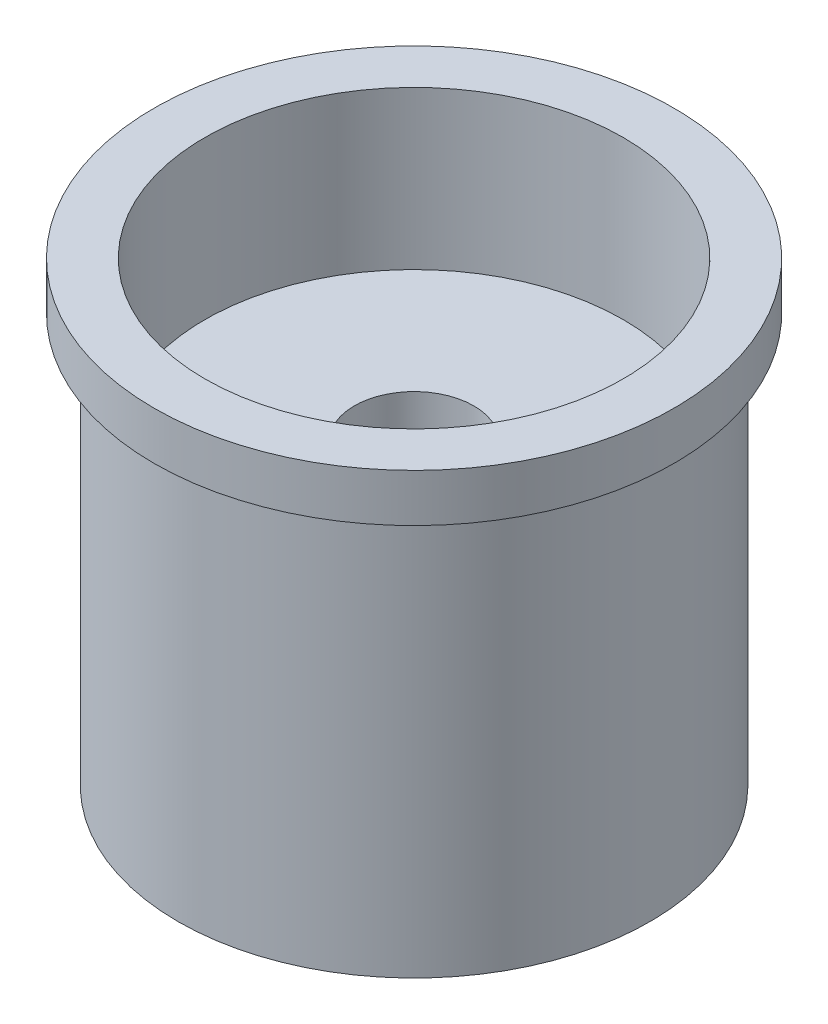
ISO-10303-21;
HEADER;
FILE_DESCRIPTION(('STEP AP214'),'2;1');
FILE_NAME('part.step','',(''),(''),'','','');
FILE_SCHEMA(('AUTOMOTIVE_DESIGN { 1 0 10303 214 1 1 1 1 }'));
ENDSEC;
DATA;
#1=APPLICATION_CONTEXT('core data for automotive mechanical design processes');
#2=APPLICATION_PROTOCOL_DEFINITION('international standard','automotive_design',2000,#1);
#3=PRODUCT_CONTEXT('',#1,'mechanical');
#4=PRODUCT('Part','Part','',(#3));
#5=PRODUCT_RELATED_PRODUCT_CATEGORY('part','',(#4));
#6=PRODUCT_DEFINITION_FORMATION('','',#4);
#7=PRODUCT_DEFINITION_CONTEXT('part definition',#1,'design');
#8=PRODUCT_DEFINITION('design','',#6,#7);
#9=PRODUCT_DEFINITION_SHAPE('','',#8);
#10=(LENGTH_UNIT() NAMED_UNIT(*) SI_UNIT(.MILLI.,.METRE.));
#11=(NAMED_UNIT(*) PLANE_ANGLE_UNIT() SI_UNIT($,.RADIAN.));
#12=(NAMED_UNIT(*) SI_UNIT($,.STERADIAN.) SOLID_ANGLE_UNIT());
#13=UNCERTAINTY_MEASURE_WITH_UNIT(LENGTH_MEASURE(1.E-05),#10,'distance_accuracy_value','');
#14=(GEOMETRIC_REPRESENTATION_CONTEXT(3) GLOBAL_UNCERTAINTY_ASSIGNED_CONTEXT((#13)) GLOBAL_UNIT_ASSIGNED_CONTEXT((#10,
#11,#12)) REPRESENTATION_CONTEXT('',''));
#15=CARTESIAN_POINT('',(0.,0.,0.));
#16=DIRECTION('',(0.,0.,1.));
#17=DIRECTION('',(1.,0.,0.));
#18=AXIS2_PLACEMENT_3D('',#15,#16,#17);
#19=CARTESIAN_POINT('',(0.,34.2,0.));
#20=DIRECTION('',(0.,-1.,0.));
#21=DIRECTION('',(0.,0.,-1.));
#22=AXIS2_PLACEMENT_3D('',#19,#20,#21);
#23=CYLINDRICAL_SURFACE('',#22,19.75);
#24=CARTESIAN_POINT('',(0.,34.2,0.));
#25=DIRECTION('',(0.,1.,0.));
#26=DIRECTION('',(0.,0.,1.));
#27=AXIS2_PLACEMENT_3D('',#24,#25,#26);
#28=CIRCLE('',#27,19.75);
#29=CARTESIAN_POINT('',(0.,34.2,19.75));
#30=VERTEX_POINT('',#29);
#31=EDGE_CURVE('E10',#30,#30,#28,.T.);
#32=ORIENTED_EDGE('',*,*,#31,.F.);
#33=EDGE_LOOP('',(#32));
#34=FACE_BOUND('',#33,.T.);
#35=CARTESIAN_POINT('',(0.,0.,0.));
#36=DIRECTION('',(0.,1.,0.));
#37=DIRECTION('',(0.,0.,1.));
#38=AXIS2_PLACEMENT_3D('',#35,#36,#37);
#39=CIRCLE('',#38,19.75);
#40=CARTESIAN_POINT('',(0.,0.,19.75));
#41=VERTEX_POINT('',#40);
#42=EDGE_CURVE('E42',#41,#41,#39,.T.);
#43=ORIENTED_EDGE('',*,*,#42,.T.);
#44=EDGE_LOOP('',(#43));
#45=FACE_BOUND('',#44,.T.);
#46=ADVANCED_FACE('F39',(#34,#45),#23,.T.);
#47=CARTESIAN_POINT('',(0.,0.,0.));
#48=DIRECTION('',(0.,1.,0.));
#49=DIRECTION('',(0.,0.,1.));
#50=AXIS2_PLACEMENT_3D('',#47,#48,#49);
#51=PLANE('',#50);
#52=CARTESIAN_POINT('',(0.,0.,0.));
#53=DIRECTION('',(0.,-1.,0.));
#54=DIRECTION('',(0.,0.,-1.));
#55=AXIS2_PLACEMENT_3D('',#52,#53,#54);
#56=CIRCLE('',#55,5.);
#57=CARTESIAN_POINT('',(0.,0.,-5.));
#58=VERTEX_POINT('',#57);
#59=EDGE_CURVE('E54',#58,#58,#56,.T.);
#60=ORIENTED_EDGE('',*,*,#59,.F.);
#61=EDGE_LOOP('',(#60));
#62=FACE_BOUND('',#61,.T.);
#63=ORIENTED_EDGE('',*,*,#42,.F.);
#64=EDGE_LOOP('',(#63));
#65=FACE_BOUND('',#64,.T.);
#66=ADVANCED_FACE('F82',(#62,#65),#51,.F.);
#67=CARTESIAN_POINT('',(0.,38.2,0.));
#68=DIRECTION('',(0.,-1.,0.));
#69=DIRECTION('',(0.,0.,-1.));
#70=AXIS2_PLACEMENT_3D('',#67,#68,#69);
#71=CYLINDRICAL_SURFACE('',#70,21.75);
#72=CARTESIAN_POINT('',(0.,38.2,0.));
#73=DIRECTION('',(0.,1.,0.));
#74=DIRECTION('',(0.,0.,1.));
#75=AXIS2_PLACEMENT_3D('',#72,#73,#74);
#76=CIRCLE('',#75,21.75);
#77=CARTESIAN_POINT('',(0.,38.2,21.75));
#78=VERTEX_POINT('',#77);
#79=EDGE_CURVE('E49',#78,#78,#76,.T.);
#80=ORIENTED_EDGE('',*,*,#79,.F.);
#81=EDGE_LOOP('',(#80));
#82=FACE_BOUND('',#81,.T.);
#83=CARTESIAN_POINT('',(0.,34.2,0.));
#84=DIRECTION('',(0.,1.,0.));
#85=DIRECTION('',(0.,0.,1.));
#86=AXIS2_PLACEMENT_3D('',#83,#84,#85);
#87=CIRCLE('',#86,21.75);
#88=CARTESIAN_POINT('',(0.,34.2,21.75));
#89=VERTEX_POINT('',#88);
#90=EDGE_CURVE('E51',#89,#89,#87,.T.);
#91=ORIENTED_EDGE('',*,*,#90,.T.);
#92=EDGE_LOOP('',(#91));
#93=FACE_BOUND('',#92,.T.);
#94=ADVANCED_FACE('F76',(#82,#93),#71,.T.);
#95=CARTESIAN_POINT('',(0.,38.2,0.));
#96=DIRECTION('',(0.,1.,0.));
#97=DIRECTION('',(0.,0.,1.));
#98=AXIS2_PLACEMENT_3D('',#95,#96,#97);
#99=PLANE('',#98);
#100=CARTESIAN_POINT('',(0.,38.2,0.));
#101=DIRECTION('',(0.,1.,0.));
#102=DIRECTION('',(0.,0.,1.));
#103=AXIS2_PLACEMENT_3D('',#100,#101,#102);
#104=CIRCLE('',#103,17.5);
#105=CARTESIAN_POINT('',(0.,38.2,17.5));
#106=VERTEX_POINT('',#105);
#107=EDGE_CURVE('E65',#106,#106,#104,.T.);
#108=ORIENTED_EDGE('',*,*,#107,.F.);
#109=EDGE_LOOP('',(#108));
#110=FACE_BOUND('',#109,.T.);
#111=ORIENTED_EDGE('',*,*,#79,.T.);
#112=EDGE_LOOP('',(#111));
#113=FACE_BOUND('',#112,.T.);
#114=ADVANCED_FACE('F72',(#110,#113),#99,.T.);
#115=CARTESIAN_POINT('',(0.,34.2,0.));
#116=DIRECTION('',(0.,1.,0.));
#117=DIRECTION('',(0.,0.,1.));
#118=AXIS2_PLACEMENT_3D('',#115,#116,#117);
#119=PLANE('',#118);
#120=ORIENTED_EDGE('',*,*,#31,.T.);
#121=EDGE_LOOP('',(#120));
#122=FACE_BOUND('',#121,.T.);
#123=ORIENTED_EDGE('',*,*,#90,.F.);
#124=EDGE_LOOP('',(#123));
#125=FACE_BOUND('',#124,.T.);
#126=ADVANCED_FACE('F75',(#122,#125),#119,.F.);
#127=CARTESIAN_POINT('',(0.,25.,0.));
#128=DIRECTION('',(0.,-1.,0.));
#129=DIRECTION('',(0.,0.,-1.));
#130=AXIS2_PLACEMENT_3D('',#127,#128,#129);
#131=CYLINDRICAL_SURFACE('',#130,5.);
#132=CARTESIAN_POINT('',(0.,25.,0.));
#133=DIRECTION('',(0.,-1.,0.));
#134=DIRECTION('',(0.,0.,-1.));
#135=AXIS2_PLACEMENT_3D('',#132,#133,#134);
#136=CIRCLE('',#135,5.);
#137=CARTESIAN_POINT('',(0.,25.,-5.));
#138=VERTEX_POINT('',#137);
#139=EDGE_CURVE('E59',#138,#138,#136,.T.);
#140=ORIENTED_EDGE('',*,*,#139,.F.);
#141=EDGE_LOOP('',(#140));
#142=FACE_BOUND('',#141,.T.);
#143=ORIENTED_EDGE('',*,*,#59,.T.);
#144=EDGE_LOOP('',(#143));
#145=FACE_BOUND('',#144,.T.);
#146=ADVANCED_FACE('F87',(#142,#145),#131,.F.);
#147=CARTESIAN_POINT('',(0.,25.,0.));
#148=DIRECTION('',(0.,-1.,0.));
#149=DIRECTION('',(0.,0.,-1.));
#150=AXIS2_PLACEMENT_3D('',#147,#148,#149);
#151=PLANE('',#150);
#152=ORIENTED_EDGE('',*,*,#139,.T.);
#153=EDGE_LOOP('',(#152));
#154=FACE_BOUND('',#153,.T.);
#155=CARTESIAN_POINT('',(0.,25.,0.));
#156=DIRECTION('',(0.,-1.,0.));
#157=DIRECTION('',(0.,0.,-1.));
#158=AXIS2_PLACEMENT_3D('',#155,#156,#157);
#159=CIRCLE('',#158,17.5);
#160=CARTESIAN_POINT('',(0.,25.,-17.5));
#161=VERTEX_POINT('',#160);
#162=EDGE_CURVE('E62',#161,#161,#159,.F.);
#163=ORIENTED_EDGE('',*,*,#162,.T.);
#164=EDGE_LOOP('',(#163));
#165=FACE_BOUND('',#164,.T.);
#166=ADVANCED_FACE('F93',(#154,#165),#151,.F.);
#167=CARTESIAN_POINT('',(0.,-24.4974746830583,0.));
#168=DIRECTION('',(0.,1.,0.));
#169=DIRECTION('',(0.,0.,1.));
#170=AXIS2_PLACEMENT_3D('',#167,#168,#169);
#171=CYLINDRICAL_SURFACE('',#170,17.5);
#172=ORIENTED_EDGE('',*,*,#107,.T.);
#173=EDGE_LOOP('',(#172));
#174=FACE_BOUND('',#173,.T.);
#175=ORIENTED_EDGE('',*,*,#162,.F.);
#176=EDGE_LOOP('',(#175));
#177=FACE_BOUND('',#176,.T.);
#178=ADVANCED_FACE('F69',(#174,#177),#171,.F.);
#179=CLOSED_SHELL('',(#46,#66,#94,#114,#126,#146,#166,#178));
#180=MANIFOLD_SOLID_BREP('B2',#179);
#181=ADVANCED_BREP_SHAPE_REPRESENTATION('',(#18,#180),#14);
#182=SHAPE_DEFINITION_REPRESENTATION(#9,#181);
ENDSEC;
END-ISO-10303-21;
